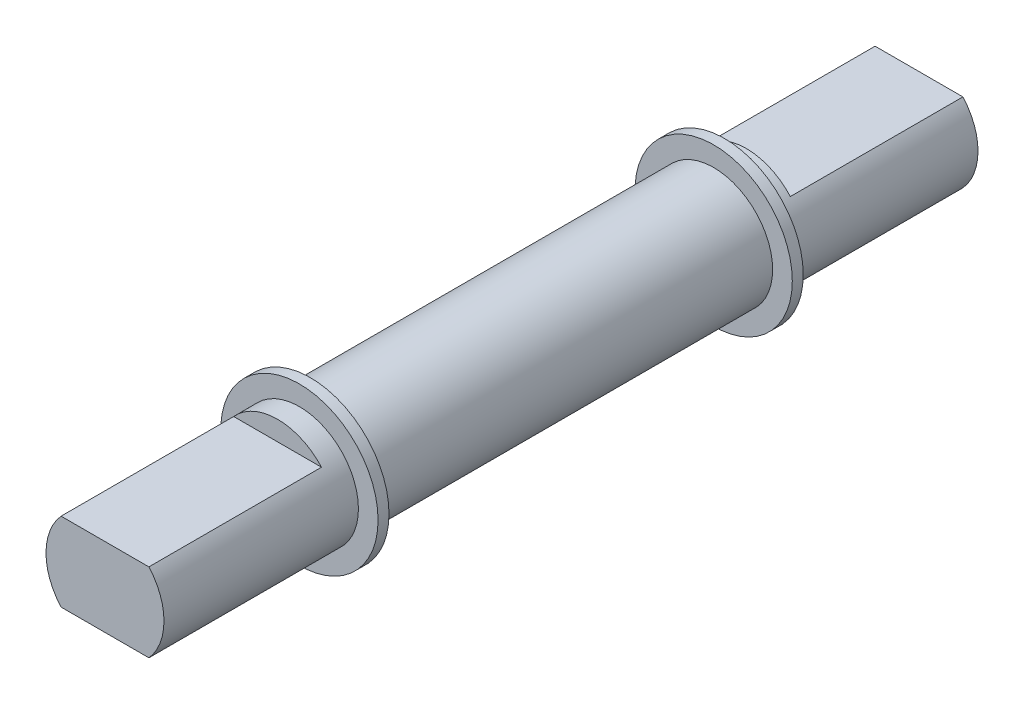
ISO-10303-21;
HEADER;
FILE_DESCRIPTION(('STEP AP214'),'2;1');
FILE_NAME('part.step','',(''),(''),'','','');
FILE_SCHEMA(('AUTOMOTIVE_DESIGN { 1 0 10303 214 1 1 1 1 }'));
ENDSEC;
DATA;
#1=APPLICATION_CONTEXT('core data for automotive mechanical design processes');
#2=APPLICATION_PROTOCOL_DEFINITION('international standard','automotive_design',2000,#1);
#3=PRODUCT_CONTEXT('',#1,'mechanical');
#4=PRODUCT('Part','Part','',(#3));
#5=PRODUCT_RELATED_PRODUCT_CATEGORY('part','',(#4));
#6=PRODUCT_DEFINITION_FORMATION('','',#4);
#7=PRODUCT_DEFINITION_CONTEXT('part definition',#1,'design');
#8=PRODUCT_DEFINITION('design','',#6,#7);
#9=PRODUCT_DEFINITION_SHAPE('','',#8);
#10=(LENGTH_UNIT() NAMED_UNIT(*) SI_UNIT(.MILLI.,.METRE.));
#11=(NAMED_UNIT(*) PLANE_ANGLE_UNIT() SI_UNIT($,.RADIAN.));
#12=(NAMED_UNIT(*) SI_UNIT($,.STERADIAN.) SOLID_ANGLE_UNIT());
#13=UNCERTAINTY_MEASURE_WITH_UNIT(LENGTH_MEASURE(1.E-05),#10,'distance_accuracy_value','');
#14=(GEOMETRIC_REPRESENTATION_CONTEXT(3) GLOBAL_UNCERTAINTY_ASSIGNED_CONTEXT((#13)) GLOBAL_UNIT_ASSIGNED_CONTEXT((#10,
#11,#12)) REPRESENTATION_CONTEXT('',''));
#15=CARTESIAN_POINT('',(0.,0.,0.));
#16=DIRECTION('',(0.,0.,1.));
#17=DIRECTION('',(1.,0.,0.));
#18=AXIS2_PLACEMENT_3D('',#15,#16,#17);
#19=CARTESIAN_POINT('',(0.,0.,-10.73));
#20=DIRECTION('',(0.,0.,-1.));
#21=DIRECTION('',(1.,0.,0.));
#22=AXIS2_PLACEMENT_3D('',#19,#20,#21);
#23=PLANE('',#22);
#24=CARTESIAN_POINT('',(0.,0.,-10.73));
#25=DIRECTION('',(0.,0.,1.));
#26=DIRECTION('',(1.,0.,0.));
#27=AXIS2_PLACEMENT_3D('',#24,#25,#26);
#28=CIRCLE('',#27,2.7);
#29=CARTESIAN_POINT('',(2.01,1.80274790250884,-10.73));
#30=VERTEX_POINT('',#29);
#31=CARTESIAN_POINT('',(-2.01,1.80274790250884,-10.73));
#32=VERTEX_POINT('',#31);
#33=EDGE_CURVE('E112',#30,#32,#28,.T.);
#34=ORIENTED_EDGE('',*,*,#33,.F.);
#35=DIRECTION('',(-1.,0.,0.));
#36=VECTOR('',#35,1.);
#37=CARTESIAN_POINT('',(0.,1.80274790250884,-10.73));
#38=LINE('',#37,#36);
#39=EDGE_CURVE('E11',#30,#32,#38,.T.);
#40=ORIENTED_EDGE('',*,*,#39,.T.);
#41=EDGE_LOOP('',(#34,#40));
#42=FACE_BOUND('',#41,.T.);
#43=ADVANCED_FACE('F41',(#42),#23,.T.);
#44=CARTESIAN_POINT('',(0.,0.,10.73));
#45=DIRECTION('',(0.,0.,1.));
#46=DIRECTION('',(1.,0.,0.));
#47=AXIS2_PLACEMENT_3D('',#44,#45,#46);
#48=PLANE('',#47);
#49=CARTESIAN_POINT('',(0.,0.,10.73));
#50=DIRECTION('',(0.,0.,1.));
#51=DIRECTION('',(1.,0.,0.));
#52=AXIS2_PLACEMENT_3D('',#49,#50,#51);
#53=CIRCLE('',#52,2.7);
#54=CARTESIAN_POINT('',(-2.01,-1.80274790250884,10.73));
#55=VERTEX_POINT('',#54);
#56=CARTESIAN_POINT('',(2.01,-1.80274790250884,10.73));
#57=VERTEX_POINT('',#56);
#58=EDGE_CURVE('E170',#55,#57,#53,.T.);
#59=ORIENTED_EDGE('',*,*,#58,.T.);
#60=DIRECTION('',(-1.,0.,0.));
#61=VECTOR('',#60,1.);
#62=CARTESIAN_POINT('',(0.,-1.80274790250884,10.73));
#63=LINE('',#62,#61);
#64=EDGE_CURVE('E190',#57,#55,#63,.T.);
#65=ORIENTED_EDGE('',*,*,#64,.T.);
#66=EDGE_LOOP('',(#59,#65));
#67=FACE_BOUND('',#66,.T.);
#68=ADVANCED_FACE('F203',(#67),#48,.T.);
#69=CARTESIAN_POINT('',(0.,0.,9.23));
#70=DIRECTION('',(0.,0.,-1.));
#71=DIRECTION('',(-1.,0.,0.));
#72=AXIS2_PLACEMENT_3D('',#69,#70,#71);
#73=CYLINDRICAL_SURFACE('',#72,2.7);
#74=CARTESIAN_POINT('',(0.,0.,9.23));
#75=DIRECTION('',(0.,0.,1.));
#76=DIRECTION('',(1.,0.,0.));
#77=AXIS2_PLACEMENT_3D('',#74,#75,#76);
#78=CIRCLE('',#77,2.7);
#79=CARTESIAN_POINT('',(2.7,0.,9.23));
#80=VERTEX_POINT('',#79);
#81=EDGE_CURVE('E178',#80,#80,#78,.T.);
#82=ORIENTED_EDGE('',*,*,#81,.F.);
#83=EDGE_LOOP('',(#82));
#84=FACE_BOUND('',#83,.T.);
#85=CARTESIAN_POINT('',(0.,0.,-9.23));
#86=DIRECTION('',(0.,0.,1.));
#87=DIRECTION('',(1.,0.,0.));
#88=AXIS2_PLACEMENT_3D('',#85,#86,#87);
#89=CIRCLE('',#88,2.7);
#90=CARTESIAN_POINT('',(2.7,0.,-9.23));
#91=VERTEX_POINT('',#90);
#92=EDGE_CURVE('E146',#91,#91,#89,.T.);
#93=ORIENTED_EDGE('',*,*,#92,.T.);
#94=EDGE_LOOP('',(#93));
#95=FACE_BOUND('',#94,.T.);
#96=ADVANCED_FACE('F43',(#84,#95),#73,.T.);
#97=CARTESIAN_POINT('',(0.,0.,9.73));
#98=DIRECTION('',(0.,0.,-1.));
#99=DIRECTION('',(-1.,0.,0.));
#100=AXIS2_PLACEMENT_3D('',#97,#98,#99);
#101=CYLINDRICAL_SURFACE('',#100,3.6);
#102=CARTESIAN_POINT('',(0.,0.,9.73));
#103=DIRECTION('',(0.,0.,1.));
#104=DIRECTION('',(1.,0.,0.));
#105=AXIS2_PLACEMENT_3D('',#102,#103,#104);
#106=CIRCLE('',#105,3.6);
#107=CARTESIAN_POINT('',(3.6,0.,9.73));
#108=VERTEX_POINT('',#107);
#109=EDGE_CURVE('E179',#108,#108,#106,.T.);
#110=ORIENTED_EDGE('',*,*,#109,.F.);
#111=EDGE_LOOP('',(#110));
#112=FACE_BOUND('',#111,.T.);
#113=CARTESIAN_POINT('',(0.,0.,9.23));
#114=DIRECTION('',(0.,0.,1.));
#115=DIRECTION('',(1.,0.,0.));
#116=AXIS2_PLACEMENT_3D('',#113,#114,#115);
#117=CIRCLE('',#116,3.6);
#118=CARTESIAN_POINT('',(3.6,0.,9.23));
#119=VERTEX_POINT('',#118);
#120=EDGE_CURVE('E173',#119,#119,#117,.T.);
#121=ORIENTED_EDGE('',*,*,#120,.T.);
#122=EDGE_LOOP('',(#121));
#123=FACE_BOUND('',#122,.T.);
#124=ADVANCED_FACE('F213',(#112,#123),#101,.T.);
#125=CARTESIAN_POINT('',(0.,0.,9.73));
#126=DIRECTION('',(0.,0.,1.));
#127=DIRECTION('',(1.,0.,0.));
#128=AXIS2_PLACEMENT_3D('',#125,#126,#127);
#129=PLANE('',#128);
#130=CARTESIAN_POINT('',(0.,0.,9.73));
#131=DIRECTION('',(0.,0.,1.));
#132=DIRECTION('',(1.,0.,0.));
#133=AXIS2_PLACEMENT_3D('',#130,#131,#132);
#134=CIRCLE('',#133,2.7);
#135=CARTESIAN_POINT('',(2.7,0.,9.73));
#136=VERTEX_POINT('',#135);
#137=EDGE_CURVE('E174',#136,#136,#134,.T.);
#138=ORIENTED_EDGE('',*,*,#137,.F.);
#139=EDGE_LOOP('',(#138));
#140=FACE_BOUND('',#139,.T.);
#141=ORIENTED_EDGE('',*,*,#109,.T.);
#142=EDGE_LOOP('',(#141));
#143=FACE_BOUND('',#142,.T.);
#144=ADVANCED_FACE('F355',(#140,#143),#129,.T.);
#145=CARTESIAN_POINT('',(0.,0.,9.23));
#146=DIRECTION('',(0.,0.,1.));
#147=DIRECTION('',(1.,0.,0.));
#148=AXIS2_PLACEMENT_3D('',#145,#146,#147);
#149=PLANE('',#148);
#150=ORIENTED_EDGE('',*,*,#81,.T.);
#151=EDGE_LOOP('',(#150));
#152=FACE_BOUND('',#151,.T.);
#153=ORIENTED_EDGE('',*,*,#120,.F.);
#154=EDGE_LOOP('',(#153));
#155=FACE_BOUND('',#154,.T.);
#156=ADVANCED_FACE('F227',(#152,#155),#149,.F.);
#157=CARTESIAN_POINT('',(0.,0.,10.73));
#158=DIRECTION('',(0.,0.,-1.));
#159=DIRECTION('',(-1.,0.,0.));
#160=AXIS2_PLACEMENT_3D('',#157,#158,#159);
#161=CYLINDRICAL_SURFACE('',#160,2.7);
#162=ORIENTED_EDGE('',*,*,#137,.T.);
#163=EDGE_LOOP('',(#162));
#164=FACE_BOUND('',#163,.T.);
#165=CARTESIAN_POINT('',(2.01,1.80274790250884,10.73));
#166=VERTEX_POINT('',#165);
#167=CARTESIAN_POINT('',(-2.01,1.80274790250884,10.73));
#168=VERTEX_POINT('',#167);
#169=EDGE_CURVE('E171',#166,#168,#53,.T.);
#170=ORIENTED_EDGE('',*,*,#169,.F.);
#171=DIRECTION('',(0.,0.,-1.));
#172=VECTOR('',#171,1.);
#173=CARTESIAN_POINT('',(2.01,1.80274790250884,18.63));
#174=LINE('',#173,#172);
#175=CARTESIAN_POINT('',(2.01,1.80274790250884,18.63));
#176=VERTEX_POINT('',#175);
#177=EDGE_CURVE('E161',#176,#166,#174,.T.);
#178=ORIENTED_EDGE('',*,*,#177,.F.);
#179=CARTESIAN_POINT('',(0.,0.,18.63));
#180=DIRECTION('',(0.,0.,1.));
#181=DIRECTION('',(1.,0.,0.));
#182=AXIS2_PLACEMENT_3D('',#179,#180,#181);
#183=CIRCLE('',#182,2.7);
#184=CARTESIAN_POINT('',(2.01,-1.80274790250884,18.63));
#185=VERTEX_POINT('',#184);
#186=EDGE_CURVE('E153',#185,#176,#183,.T.);
#187=ORIENTED_EDGE('',*,*,#186,.F.);
#188=DIRECTION('',(0.,0.,-1.));
#189=VECTOR('',#188,1.);
#190=CARTESIAN_POINT('',(2.01,-1.80274790250884,18.63));
#191=LINE('',#190,#189);
#192=EDGE_CURVE('E164',#185,#57,#191,.T.);
#193=ORIENTED_EDGE('',*,*,#192,.T.);
#194=ORIENTED_EDGE('',*,*,#58,.F.);
#195=DIRECTION('',(0.,0.,-1.));
#196=VECTOR('',#195,1.);
#197=CARTESIAN_POINT('',(-2.01,-1.80274790250884,18.63));
#198=LINE('',#197,#196);
#199=CARTESIAN_POINT('',(-2.01,-1.80274790250884,18.63));
#200=VERTEX_POINT('',#199);
#201=EDGE_CURVE('E167',#200,#55,#198,.T.);
#202=ORIENTED_EDGE('',*,*,#201,.F.);
#203=CARTESIAN_POINT('',(-2.01,1.80274790250884,18.63));
#204=VERTEX_POINT('',#203);
#205=EDGE_CURVE('E149',#204,#200,#183,.T.);
#206=ORIENTED_EDGE('',*,*,#205,.F.);
#207=DIRECTION('',(0.,0.,-1.));
#208=VECTOR('',#207,1.);
#209=CARTESIAN_POINT('',(-2.01,1.80274790250884,18.63));
#210=LINE('',#209,#208);
#211=EDGE_CURVE('E158',#204,#168,#210,.T.);
#212=ORIENTED_EDGE('',*,*,#211,.T.);
#213=EDGE_LOOP('',(#170,#178,#187,#193,#194,#202,#206,#212));
#214=FACE_BOUND('',#213,.T.);
#215=ADVANCED_FACE('F219',(#164,#214),#161,.T.);
#216=DIRECTION('',(-1.,0.,0.));
#217=VECTOR('',#216,1.);
#218=CARTESIAN_POINT('',(0.,1.80274790250884,10.73));
#219=LINE('',#218,#217);
#220=EDGE_CURVE('E177',#166,#168,#219,.T.);
#221=ORIENTED_EDGE('',*,*,#220,.F.);
#222=ORIENTED_EDGE('',*,*,#169,.T.);
#223=EDGE_LOOP('',(#221,#222));
#224=FACE_BOUND('',#223,.T.);
#225=ADVANCED_FACE('F209',(#224),#48,.T.);
#226=CARTESIAN_POINT('',(0.,-1.80274790250884,18.63));
#227=DIRECTION('',(0.,1.,0.));
#228=DIRECTION('',(0.,0.,1.));
#229=AXIS2_PLACEMENT_3D('',#226,#227,#228);
#230=PLANE('',#229);
#231=ORIENTED_EDGE('',*,*,#64,.F.);
#232=ORIENTED_EDGE('',*,*,#192,.F.);
#233=DIRECTION('',(1.,0.,0.));
#234=VECTOR('',#233,1.);
#235=CARTESIAN_POINT('',(0.,-1.80274790250884,18.63));
#236=LINE('',#235,#234);
#237=EDGE_CURVE('E152',#200,#185,#236,.T.);
#238=ORIENTED_EDGE('',*,*,#237,.F.);
#239=ORIENTED_EDGE('',*,*,#201,.T.);
#240=EDGE_LOOP('',(#231,#232,#238,#239));
#241=FACE_BOUND('',#240,.T.);
#242=ADVANCED_FACE('F218',(#241),#230,.F.);
#243=CARTESIAN_POINT('',(0.,1.80274790250884,18.63));
#244=DIRECTION('',(0.,1.,0.));
#245=DIRECTION('',(0.,0.,1.));
#246=AXIS2_PLACEMENT_3D('',#243,#244,#245);
#247=PLANE('',#246);
#248=ORIENTED_EDGE('',*,*,#177,.T.);
#249=ORIENTED_EDGE('',*,*,#220,.T.);
#250=ORIENTED_EDGE('',*,*,#211,.F.);
#251=DIRECTION('',(1.,0.,0.));
#252=VECTOR('',#251,1.);
#253=CARTESIAN_POINT('',(0.,1.80274790250884,18.63));
#254=LINE('',#253,#252);
#255=EDGE_CURVE('E155',#204,#176,#254,.T.);
#256=ORIENTED_EDGE('',*,*,#255,.T.);
#257=EDGE_LOOP('',(#248,#249,#250,#256));
#258=FACE_BOUND('',#257,.T.);
#259=ADVANCED_FACE('F225',(#258),#247,.T.);
#260=CARTESIAN_POINT('',(0.,0.,18.63));
#261=DIRECTION('',(0.,0.,1.));
#262=DIRECTION('',(1.,0.,0.));
#263=AXIS2_PLACEMENT_3D('',#260,#261,#262);
#264=PLANE('',#263);
#265=ORIENTED_EDGE('',*,*,#205,.T.);
#266=ORIENTED_EDGE('',*,*,#237,.T.);
#267=ORIENTED_EDGE('',*,*,#186,.T.);
#268=ORIENTED_EDGE('',*,*,#255,.F.);
#269=EDGE_LOOP('',(#265,#266,#267,#268));
#270=FACE_BOUND('',#269,.T.);
#271=ADVANCED_FACE('F237',(#270),#264,.T.);
#272=CARTESIAN_POINT('',(0.,0.,-9.73));
#273=DIRECTION('',(0.,0.,1.));
#274=DIRECTION('',(1.,0.,0.));
#275=AXIS2_PLACEMENT_3D('',#272,#273,#274);
#276=CYLINDRICAL_SURFACE('',#275,3.6);
#277=CARTESIAN_POINT('',(0.,0.,-9.73));
#278=DIRECTION('',(0.,0.,1.));
#279=DIRECTION('',(1.,0.,0.));
#280=AXIS2_PLACEMENT_3D('',#277,#278,#279);
#281=CIRCLE('',#280,3.6);
#282=CARTESIAN_POINT('',(3.6,0.,-9.73));
#283=VERTEX_POINT('',#282);
#284=EDGE_CURVE('E143',#283,#283,#281,.T.);
#285=ORIENTED_EDGE('',*,*,#284,.T.);
#286=EDGE_LOOP('',(#285));
#287=FACE_BOUND('',#286,.T.);
#288=CARTESIAN_POINT('',(0.,0.,-9.23));
#289=DIRECTION('',(0.,0.,1.));
#290=DIRECTION('',(1.,0.,0.));
#291=AXIS2_PLACEMENT_3D('',#288,#289,#290);
#292=CIRCLE('',#291,3.6);
#293=CARTESIAN_POINT('',(3.6,0.,-9.23));
#294=VERTEX_POINT('',#293);
#295=EDGE_CURVE('E139',#294,#294,#292,.T.);
#296=ORIENTED_EDGE('',*,*,#295,.F.);
#297=EDGE_LOOP('',(#296));
#298=FACE_BOUND('',#297,.T.);
#299=ADVANCED_FACE('F243',(#287,#298),#276,.T.);
#300=CARTESIAN_POINT('',(0.,0.,-9.73));
#301=DIRECTION('',(0.,0.,-1.));
#302=DIRECTION('',(1.,0.,0.));
#303=AXIS2_PLACEMENT_3D('',#300,#301,#302);
#304=PLANE('',#303);
#305=CARTESIAN_POINT('',(0.,0.,-9.73));
#306=DIRECTION('',(0.,0.,1.));
#307=DIRECTION('',(1.,0.,0.));
#308=AXIS2_PLACEMENT_3D('',#305,#306,#307);
#309=CIRCLE('',#308,2.7);
#310=CARTESIAN_POINT('',(2.7,0.,-9.73));
#311=VERTEX_POINT('',#310);
#312=EDGE_CURVE('E114',#311,#311,#309,.T.);
#313=ORIENTED_EDGE('',*,*,#312,.T.);
#314=EDGE_LOOP('',(#313));
#315=FACE_BOUND('',#314,.T.);
#316=ORIENTED_EDGE('',*,*,#284,.F.);
#317=EDGE_LOOP('',(#316));
#318=FACE_BOUND('',#317,.T.);
#319=ADVANCED_FACE('F249',(#315,#318),#304,.T.);
#320=CARTESIAN_POINT('',(0.,0.,-9.23));
#321=DIRECTION('',(0.,0.,-1.));
#322=DIRECTION('',(1.,0.,0.));
#323=AXIS2_PLACEMENT_3D('',#320,#321,#322);
#324=PLANE('',#323);
#325=ORIENTED_EDGE('',*,*,#92,.F.);
#326=EDGE_LOOP('',(#325));
#327=FACE_BOUND('',#326,.T.);
#328=ORIENTED_EDGE('',*,*,#295,.T.);
#329=EDGE_LOOP('',(#328));
#330=FACE_BOUND('',#329,.T.);
#331=ADVANCED_FACE('F200',(#327,#330),#324,.F.);
#332=CARTESIAN_POINT('',(0.,0.,-10.73));
#333=DIRECTION('',(0.,0.,1.));
#334=DIRECTION('',(1.,0.,0.));
#335=AXIS2_PLACEMENT_3D('',#332,#333,#334);
#336=CYLINDRICAL_SURFACE('',#335,2.7);
#337=DIRECTION('',(0.,0.,1.));
#338=VECTOR('',#337,1.);
#339=CARTESIAN_POINT('',(2.01,1.80274790250884,-18.63));
#340=LINE('',#339,#338);
#341=CARTESIAN_POINT('',(2.01,1.80274790250884,-18.63));
#342=VERTEX_POINT('',#341);
#343=EDGE_CURVE('E115',#342,#30,#340,.T.);
#344=ORIENTED_EDGE('',*,*,#343,.T.);
#345=ORIENTED_EDGE('',*,*,#33,.T.);
#346=DIRECTION('',(0.,0.,1.));
#347=VECTOR('',#346,1.);
#348=CARTESIAN_POINT('',(-2.01,1.80274790250884,-18.63));
#349=LINE('',#348,#347);
#350=CARTESIAN_POINT('',(-2.01,1.80274790250884,-18.63));
#351=VERTEX_POINT('',#350);
#352=EDGE_CURVE('E103',#351,#32,#349,.T.);
#353=ORIENTED_EDGE('',*,*,#352,.F.);
#354=CARTESIAN_POINT('',(0.,0.,-18.63));
#355=DIRECTION('',(0.,0.,1.));
#356=DIRECTION('',(1.,0.,0.));
#357=AXIS2_PLACEMENT_3D('',#354,#355,#356);
#358=CIRCLE('',#357,2.7);
#359=CARTESIAN_POINT('',(-2.01,-1.80274790250884,-18.63));
#360=VERTEX_POINT('',#359);
#361=EDGE_CURVE('E110',#351,#360,#358,.T.);
#362=ORIENTED_EDGE('',*,*,#361,.T.);
#363=DIRECTION('',(0.,0.,1.));
#364=VECTOR('',#363,1.);
#365=CARTESIAN_POINT('',(-2.01,-1.80274790250884,-18.63));
#366=LINE('',#365,#364);
#367=CARTESIAN_POINT('',(-2.01,-1.80274790250884,-10.73));
#368=VERTEX_POINT('',#367);
#369=EDGE_CURVE('E129',#360,#368,#366,.T.);
#370=ORIENTED_EDGE('',*,*,#369,.T.);
#371=CARTESIAN_POINT('',(2.01,-1.80274790250884,-10.73));
#372=VERTEX_POINT('',#371);
#373=EDGE_CURVE('E140',#368,#372,#28,.T.);
#374=ORIENTED_EDGE('',*,*,#373,.T.);
#375=DIRECTION('',(0.,0.,1.));
#376=VECTOR('',#375,1.);
#377=CARTESIAN_POINT('',(2.01,-1.80274790250884,-18.63));
#378=LINE('',#377,#376);
#379=CARTESIAN_POINT('',(2.01,-1.80274790250884,-18.63));
#380=VERTEX_POINT('',#379);
#381=EDGE_CURVE('E133',#380,#372,#378,.T.);
#382=ORIENTED_EDGE('',*,*,#381,.F.);
#383=EDGE_CURVE('E123',#380,#342,#358,.T.);
#384=ORIENTED_EDGE('',*,*,#383,.T.);
#385=EDGE_LOOP('',(#344,#345,#353,#362,#370,#374,#382,#384));
#386=FACE_BOUND('',#385,.T.);
#387=ORIENTED_EDGE('',*,*,#312,.F.);
#388=EDGE_LOOP('',(#387));
#389=FACE_BOUND('',#388,.T.);
#390=ADVANCED_FACE('F106',(#386,#389),#336,.T.);
#391=DIRECTION('',(-1.,0.,0.));
#392=VECTOR('',#391,1.);
#393=CARTESIAN_POINT('',(0.,-1.80274790250884,-10.73));
#394=LINE('',#393,#392);
#395=EDGE_CURVE('E49',#372,#368,#394,.T.);
#396=ORIENTED_EDGE('',*,*,#395,.F.);
#397=ORIENTED_EDGE('',*,*,#373,.F.);
#398=EDGE_LOOP('',(#396,#397));
#399=FACE_BOUND('',#398,.T.);
#400=ADVANCED_FACE('F192',(#399),#23,.T.);
#401=CARTESIAN_POINT('',(0.,1.80274790250884,-18.63));
#402=DIRECTION('',(0.,-1.,0.));
#403=DIRECTION('',(0.,0.,-1.));
#404=AXIS2_PLACEMENT_3D('',#401,#402,#403);
#405=PLANE('',#404);
#406=ORIENTED_EDGE('',*,*,#39,.F.);
#407=ORIENTED_EDGE('',*,*,#343,.F.);
#408=DIRECTION('',(1.,0.,0.));
#409=VECTOR('',#408,1.);
#410=CARTESIAN_POINT('',(0.,1.80274790250884,-18.63));
#411=LINE('',#410,#409);
#412=EDGE_CURVE('E118',#351,#342,#411,.T.);
#413=ORIENTED_EDGE('',*,*,#412,.F.);
#414=ORIENTED_EDGE('',*,*,#352,.T.);
#415=EDGE_LOOP('',(#406,#407,#413,#414));
#416=FACE_BOUND('',#415,.T.);
#417=ADVANCED_FACE('F119',(#416),#405,.F.);
#418=CARTESIAN_POINT('',(0.,-1.80274790250884,-18.63));
#419=DIRECTION('',(0.,-1.,0.));
#420=DIRECTION('',(0.,0.,-1.));
#421=AXIS2_PLACEMENT_3D('',#418,#419,#420);
#422=PLANE('',#421);
#423=ORIENTED_EDGE('',*,*,#381,.T.);
#424=ORIENTED_EDGE('',*,*,#395,.T.);
#425=ORIENTED_EDGE('',*,*,#369,.F.);
#426=DIRECTION('',(1.,0.,0.));
#427=VECTOR('',#426,1.);
#428=CARTESIAN_POINT('',(0.,-1.80274790250884,-18.63));
#429=LINE('',#428,#427);
#430=EDGE_CURVE('E127',#360,#380,#429,.T.);
#431=ORIENTED_EDGE('',*,*,#430,.T.);
#432=EDGE_LOOP('',(#423,#424,#425,#431));
#433=FACE_BOUND('',#432,.T.);
#434=ADVANCED_FACE('F191',(#433),#422,.T.);
#435=CARTESIAN_POINT('',(0.,0.,-18.63));
#436=DIRECTION('',(0.,0.,-1.));
#437=DIRECTION('',(1.,0.,0.));
#438=AXIS2_PLACEMENT_3D('',#435,#436,#437);
#439=PLANE('',#438);
#440=ORIENTED_EDGE('',*,*,#361,.F.);
#441=ORIENTED_EDGE('',*,*,#412,.T.);
#442=ORIENTED_EDGE('',*,*,#383,.F.);
#443=ORIENTED_EDGE('',*,*,#430,.F.);
#444=EDGE_LOOP('',(#440,#441,#442,#443));
#445=FACE_BOUND('',#444,.T.);
#446=ADVANCED_FACE('F125',(#445),#439,.T.);
#447=CLOSED_SHELL('',(#43,#68,#96,#124,#144,#156,#215,#225,#242,#259,#271,#299,#319,#331,#390,
#400,#417,#434,#446));
#448=MANIFOLD_SOLID_BREP('B2',#447);
#449=ADVANCED_BREP_SHAPE_REPRESENTATION('',(#18,#448),#14);
#450=SHAPE_DEFINITION_REPRESENTATION(#9,#449);
ENDSEC;
END-ISO-10303-21;
